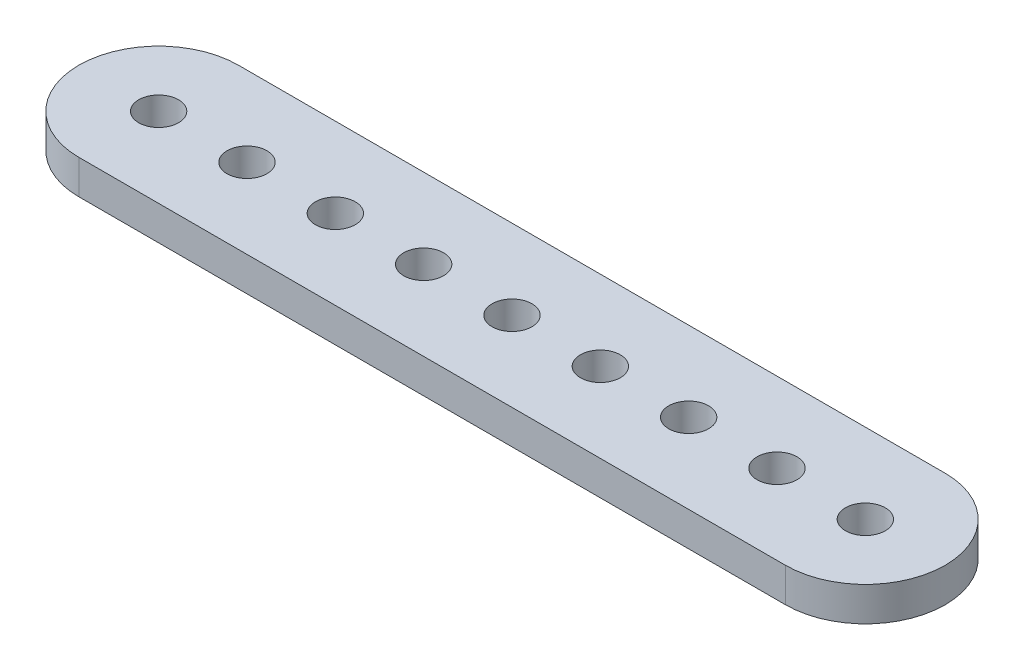
ISO-10303-21;
HEADER;
FILE_DESCRIPTION(('STEP AP214'),'2;1');
FILE_NAME('part.step','',(''),(''),'','','');
FILE_SCHEMA(('AUTOMOTIVE_DESIGN { 1 0 10303 214 1 1 1 1 }'));
ENDSEC;
DATA;
#1=APPLICATION_CONTEXT('core data for automotive mechanical design processes');
#2=APPLICATION_PROTOCOL_DEFINITION('international standard','automotive_design',2000,#1);
#3=PRODUCT_CONTEXT('',#1,'mechanical');
#4=PRODUCT('Part','Part','',(#3));
#5=PRODUCT_RELATED_PRODUCT_CATEGORY('part','',(#4));
#6=PRODUCT_DEFINITION_FORMATION('','',#4);
#7=PRODUCT_DEFINITION_CONTEXT('part definition',#1,'design');
#8=PRODUCT_DEFINITION('design','',#6,#7);
#9=PRODUCT_DEFINITION_SHAPE('','',#8);
#10=(LENGTH_UNIT() NAMED_UNIT(*) SI_UNIT(.MILLI.,.METRE.));
#11=(NAMED_UNIT(*) PLANE_ANGLE_UNIT() SI_UNIT($,.RADIAN.));
#12=(NAMED_UNIT(*) SI_UNIT($,.STERADIAN.) SOLID_ANGLE_UNIT());
#13=UNCERTAINTY_MEASURE_WITH_UNIT(LENGTH_MEASURE(1.E-05),#10,'distance_accuracy_value','');
#14=(GEOMETRIC_REPRESENTATION_CONTEXT(3) GLOBAL_UNCERTAINTY_ASSIGNED_CONTEXT((#13)) GLOBAL_UNIT_ASSIGNED_CONTEXT((#10,
#11,#12)) REPRESENTATION_CONTEXT('',''));
#15=CARTESIAN_POINT('',(0.,0.,0.));
#16=DIRECTION('',(0.,0.,1.));
#17=DIRECTION('',(1.,0.,0.));
#18=AXIS2_PLACEMENT_3D('',#15,#16,#17);
#19=CARTESIAN_POINT('',(19.1257208754836,6.,-9.45587762598098));
#20=DIRECTION('',(0.,1.,0.));
#21=DIRECTION('',(0.,0.,1.));
#22=AXIS2_PLACEMENT_3D('',#19,#20,#21);
#23=PLANE('',#22);
#24=CARTESIAN_POINT('',(19.1257208754836,6.,-9.45587762598098));
#25=DIRECTION('',(0.,1.,0.));
#26=DIRECTION('',(0.,0.,1.));
#27=AXIS2_PLACEMENT_3D('',#24,#25,#26);
#28=CIRCLE('',#27,3.50000000000001);
#29=CARTESIAN_POINT('',(19.1257208754836,6.,-5.95587762598097));
#30=VERTEX_POINT('',#29);
#31=EDGE_CURVE('E289',#30,#30,#28,.T.);
#32=ORIENTED_EDGE('',*,*,#31,.F.);
#33=EDGE_LOOP('',(#32));
#34=FACE_BOUND('',#33,.T.);
#35=CARTESIAN_POINT('',(-42.8742791245164,6.,-9.45587762598098));
#36=DIRECTION('',(0.,1.,0.));
#37=DIRECTION('',(0.,0.,1.));
#38=AXIS2_PLACEMENT_3D('',#35,#36,#37);
#39=CIRCLE('',#38,3.50000000000001);
#40=CARTESIAN_POINT('',(-42.8742791245164,6.,-5.95587762598097));
#41=VERTEX_POINT('',#40);
#42=EDGE_CURVE('E277',#41,#41,#39,.T.);
#43=ORIENTED_EDGE('',*,*,#42,.F.);
#44=EDGE_LOOP('',(#43));
#45=FACE_BOUND('',#44,.T.);
#46=CARTESIAN_POINT('',(-11.8742791245164,6.,-9.45587762598098));
#47=DIRECTION('',(0.,1.,0.));
#48=DIRECTION('',(0.,0.,1.));
#49=AXIS2_PLACEMENT_3D('',#46,#47,#48);
#50=CIRCLE('',#49,3.50000000000001);
#51=CARTESIAN_POINT('',(-11.8742791245164,6.,-5.95587762598097));
#52=VERTEX_POINT('',#51);
#53=EDGE_CURVE('E265',#52,#52,#50,.T.);
#54=ORIENTED_EDGE('',*,*,#53,.F.);
#55=EDGE_LOOP('',(#54));
#56=FACE_BOUND('',#55,.T.);
#57=CARTESIAN_POINT('',(-89.3742791245164,6.,-9.45587762598098));
#58=DIRECTION('',(0.,1.,0.));
#59=DIRECTION('',(0.,0.,1.));
#60=AXIS2_PLACEMENT_3D('',#57,#58,#59);
#61=CIRCLE('',#60,3.50000000000001);
#62=CARTESIAN_POINT('',(-89.3742791245164,6.,-5.95587762598097));
#63=VERTEX_POINT('',#62);
#64=EDGE_CURVE('E253',#63,#63,#61,.T.);
#65=ORIENTED_EDGE('',*,*,#64,.F.);
#66=EDGE_LOOP('',(#65));
#67=FACE_BOUND('',#66,.T.);
#68=DIRECTION('',(1.,0.,0.));
#69=VECTOR('',#68,1.);
#70=CARTESIAN_POINT('',(-104.874279124516,6.,4.54412237401902));
#71=LINE('',#70,#69);
#72=CARTESIAN_POINT('',(-104.874279124516,6.,4.54412237401902));
#73=VERTEX_POINT('',#72);
#74=CARTESIAN_POINT('',(19.1257208754836,6.,4.54412237401902));
#75=VERTEX_POINT('',#74);
#76=EDGE_CURVE('E224',#73,#75,#71,.T.);
#77=ORIENTED_EDGE('',*,*,#76,.T.);
#78=CARTESIAN_POINT('',(19.1257208754836,6.,-9.45587762598098));
#79=DIRECTION('',(0.,1.,0.));
#80=DIRECTION('',(0.,0.,1.));
#81=AXIS2_PLACEMENT_3D('',#78,#79,#80);
#82=CIRCLE('',#81,14.);
#83=CARTESIAN_POINT('',(19.1257208754836,6.,-23.455877625981));
#84=VERTEX_POINT('',#83);
#85=EDGE_CURVE('E216',#75,#84,#82,.T.);
#86=ORIENTED_EDGE('',*,*,#85,.T.);
#87=DIRECTION('',(1.,0.,0.));
#88=VECTOR('',#87,1.);
#89=CARTESIAN_POINT('',(-104.874279124516,6.,-23.455877625981));
#90=LINE('',#89,#88);
#91=CARTESIAN_POINT('',(-104.874279124516,6.,-23.455877625981));
#92=VERTEX_POINT('',#91);
#93=EDGE_CURVE('E223',#92,#84,#90,.T.);
#94=ORIENTED_EDGE('',*,*,#93,.F.);
#95=CARTESIAN_POINT('',(-104.874279124516,6.,-9.45587762598098));
#96=DIRECTION('',(0.,-1.,0.));
#97=DIRECTION('',(0.,0.,-1.));
#98=AXIS2_PLACEMENT_3D('',#95,#96,#97);
#99=CIRCLE('',#98,14.);
#100=EDGE_CURVE('E233',#73,#92,#99,.T.);
#101=ORIENTED_EDGE('',*,*,#100,.F.);
#102=EDGE_LOOP('',(#77,#86,#94,#101));
#103=FACE_BOUND('',#102,.T.);
#104=CARTESIAN_POINT('',(-73.8742791245164,6.,-9.45587762598098));
#105=DIRECTION('',(0.,1.,0.));
#106=DIRECTION('',(0.,0.,1.));
#107=AXIS2_PLACEMENT_3D('',#104,#105,#106);
#108=CIRCLE('',#107,3.50000000000001);
#109=CARTESIAN_POINT('',(-73.8742791245164,6.,-5.95587762598097));
#110=VERTEX_POINT('',#109);
#111=EDGE_CURVE('E240',#110,#110,#108,.T.);
#112=ORIENTED_EDGE('',*,*,#111,.F.);
#113=EDGE_LOOP('',(#112));
#114=FACE_BOUND('',#113,.T.);
#115=CARTESIAN_POINT('',(-104.874279124516,6.,-9.45587762598098));
#116=DIRECTION('',(0.,1.,0.));
#117=DIRECTION('',(0.,0.,1.));
#118=AXIS2_PLACEMENT_3D('',#115,#116,#117);
#119=CIRCLE('',#118,3.50000000000001);
#120=CARTESIAN_POINT('',(-104.874279124516,6.,-5.95587762598097));
#121=VERTEX_POINT('',#120);
#122=EDGE_CURVE('E259',#121,#121,#119,.T.);
#123=ORIENTED_EDGE('',*,*,#122,.F.);
#124=EDGE_LOOP('',(#123));
#125=FACE_BOUND('',#124,.T.);
#126=CARTESIAN_POINT('',(-27.3742791245164,6.,-9.45587762598098));
#127=DIRECTION('',(0.,1.,0.));
#128=DIRECTION('',(0.,0.,1.));
#129=AXIS2_PLACEMENT_3D('',#126,#127,#128);
#130=CIRCLE('',#129,3.50000000000001);
#131=CARTESIAN_POINT('',(-27.3742791245164,6.,-5.95587762598097));
#132=VERTEX_POINT('',#131);
#133=EDGE_CURVE('E271',#132,#132,#130,.T.);
#134=ORIENTED_EDGE('',*,*,#133,.F.);
#135=EDGE_LOOP('',(#134));
#136=FACE_BOUND('',#135,.T.);
#137=CARTESIAN_POINT('',(-58.3742791245164,6.,-9.45587762598098));
#138=DIRECTION('',(0.,1.,0.));
#139=DIRECTION('',(0.,0.,1.));
#140=AXIS2_PLACEMENT_3D('',#137,#138,#139);
#141=CIRCLE('',#140,3.50000000000001);
#142=CARTESIAN_POINT('',(-58.3742791245164,6.,-5.95587762598097));
#143=VERTEX_POINT('',#142);
#144=EDGE_CURVE('E283',#143,#143,#141,.T.);
#145=ORIENTED_EDGE('',*,*,#144,.F.);
#146=EDGE_LOOP('',(#145));
#147=FACE_BOUND('',#146,.T.);
#148=CARTESIAN_POINT('',(3.62572087548364,6.,-9.45587762598098));
#149=DIRECTION('',(0.,1.,0.));
#150=DIRECTION('',(0.,0.,1.));
#151=AXIS2_PLACEMENT_3D('',#148,#149,#150);
#152=CIRCLE('',#151,3.50000000000001);
#153=CARTESIAN_POINT('',(3.62572087548364,6.,-5.95587762598097));
#154=VERTEX_POINT('',#153);
#155=EDGE_CURVE('E295',#154,#154,#152,.T.);
#156=ORIENTED_EDGE('',*,*,#155,.F.);
#157=EDGE_LOOP('',(#156));
#158=FACE_BOUND('',#157,.T.);
#159=ADVANCED_FACE('F174',(#34,#45,#56,#67,#103,#114,#125,#136,#147,#158),#23,.T.);
#160=CARTESIAN_POINT('',(19.1257208754836,0.,-9.45587762598098));
#161=DIRECTION('',(0.,1.,0.));
#162=DIRECTION('',(0.,0.,1.));
#163=AXIS2_PLACEMENT_3D('',#160,#161,#162);
#164=PLANE('',#163);
#165=DIRECTION('',(1.,0.,0.));
#166=VECTOR('',#165,1.);
#167=CARTESIAN_POINT('',(-104.874279124516,0.,4.54412237401902));
#168=LINE('',#167,#166);
#169=CARTESIAN_POINT('',(-104.874279124516,0.,4.54412237401902));
#170=VERTEX_POINT('',#169);
#171=CARTESIAN_POINT('',(19.1257208754836,0.,4.54412237401902));
#172=VERTEX_POINT('',#171);
#173=EDGE_CURVE('E238',#170,#172,#168,.T.);
#174=ORIENTED_EDGE('',*,*,#173,.F.);
#175=CARTESIAN_POINT('',(-104.874279124516,0.,-9.45587762598098));
#176=DIRECTION('',(0.,-1.,0.));
#177=DIRECTION('',(0.,0.,-1.));
#178=AXIS2_PLACEMENT_3D('',#175,#176,#177);
#179=CIRCLE('',#178,14.);
#180=CARTESIAN_POINT('',(-104.874279124516,0.,-23.455877625981));
#181=VERTEX_POINT('',#180);
#182=EDGE_CURVE('E244',#170,#181,#179,.T.);
#183=ORIENTED_EDGE('',*,*,#182,.T.);
#184=DIRECTION('',(1.,0.,0.));
#185=VECTOR('',#184,1.);
#186=CARTESIAN_POINT('',(-104.874279124516,0.,-23.455877625981));
#187=LINE('',#186,#185);
#188=CARTESIAN_POINT('',(19.1257208754836,0.,-23.455877625981));
#189=VERTEX_POINT('',#188);
#190=EDGE_CURVE('E242',#181,#189,#187,.T.);
#191=ORIENTED_EDGE('',*,*,#190,.T.);
#192=CARTESIAN_POINT('',(19.1257208754836,0.,-9.45587762598098));
#193=DIRECTION('',(0.,1.,0.));
#194=DIRECTION('',(0.,0.,1.));
#195=AXIS2_PLACEMENT_3D('',#192,#193,#194);
#196=CIRCLE('',#195,14.);
#197=EDGE_CURVE('E229',#172,#189,#196,.T.);
#198=ORIENTED_EDGE('',*,*,#197,.F.);
#199=EDGE_LOOP('',(#174,#183,#191,#198));
#200=FACE_BOUND('',#199,.T.);
#201=CARTESIAN_POINT('',(-73.8742791245164,0.,-9.45587762598098));
#202=DIRECTION('',(0.,1.,0.));
#203=DIRECTION('',(0.,0.,1.));
#204=AXIS2_PLACEMENT_3D('',#201,#202,#203);
#205=CIRCLE('',#204,3.50000000000001);
#206=CARTESIAN_POINT('',(-73.8742791245164,0.,-5.95587762598097));
#207=VERTEX_POINT('',#206);
#208=EDGE_CURVE('E250',#207,#207,#205,.T.);
#209=ORIENTED_EDGE('',*,*,#208,.T.);
#210=EDGE_LOOP('',(#209));
#211=FACE_BOUND('',#210,.T.);
#212=CARTESIAN_POINT('',(-89.3742791245164,0.,-9.45587762598098));
#213=DIRECTION('',(0.,1.,0.));
#214=DIRECTION('',(0.,0.,1.));
#215=AXIS2_PLACEMENT_3D('',#212,#213,#214);
#216=CIRCLE('',#215,3.50000000000001);
#217=CARTESIAN_POINT('',(-89.3742791245164,0.,-5.95587762598097));
#218=VERTEX_POINT('',#217);
#219=EDGE_CURVE('E256',#218,#218,#216,.T.);
#220=ORIENTED_EDGE('',*,*,#219,.T.);
#221=EDGE_LOOP('',(#220));
#222=FACE_BOUND('',#221,.T.);
#223=CARTESIAN_POINT('',(-104.874279124516,0.,-9.45587762598098));
#224=DIRECTION('',(0.,1.,0.));
#225=DIRECTION('',(0.,0.,1.));
#226=AXIS2_PLACEMENT_3D('',#223,#224,#225);
#227=CIRCLE('',#226,3.50000000000001);
#228=CARTESIAN_POINT('',(-104.874279124516,0.,-5.95587762598097));
#229=VERTEX_POINT('',#228);
#230=EDGE_CURVE('E262',#229,#229,#227,.T.);
#231=ORIENTED_EDGE('',*,*,#230,.T.);
#232=EDGE_LOOP('',(#231));
#233=FACE_BOUND('',#232,.T.);
#234=CARTESIAN_POINT('',(-11.8742791245164,0.,-9.45587762598098));
#235=DIRECTION('',(0.,1.,0.));
#236=DIRECTION('',(0.,0.,1.));
#237=AXIS2_PLACEMENT_3D('',#234,#235,#236);
#238=CIRCLE('',#237,3.50000000000001);
#239=CARTESIAN_POINT('',(-11.8742791245164,0.,-5.95587762598097));
#240=VERTEX_POINT('',#239);
#241=EDGE_CURVE('E268',#240,#240,#238,.T.);
#242=ORIENTED_EDGE('',*,*,#241,.T.);
#243=EDGE_LOOP('',(#242));
#244=FACE_BOUND('',#243,.T.);
#245=CARTESIAN_POINT('',(-27.3742791245164,0.,-9.45587762598098));
#246=DIRECTION('',(0.,1.,0.));
#247=DIRECTION('',(0.,0.,1.));
#248=AXIS2_PLACEMENT_3D('',#245,#246,#247);
#249=CIRCLE('',#248,3.50000000000001);
#250=CARTESIAN_POINT('',(-27.3742791245164,0.,-5.95587762598097));
#251=VERTEX_POINT('',#250);
#252=EDGE_CURVE('E274',#251,#251,#249,.T.);
#253=ORIENTED_EDGE('',*,*,#252,.T.);
#254=EDGE_LOOP('',(#253));
#255=FACE_BOUND('',#254,.T.);
#256=CARTESIAN_POINT('',(-42.8742791245164,0.,-9.45587762598098));
#257=DIRECTION('',(0.,1.,0.));
#258=DIRECTION('',(0.,0.,1.));
#259=AXIS2_PLACEMENT_3D('',#256,#257,#258);
#260=CIRCLE('',#259,3.50000000000001);
#261=CARTESIAN_POINT('',(-42.8742791245164,0.,-5.95587762598097));
#262=VERTEX_POINT('',#261);
#263=EDGE_CURVE('E280',#262,#262,#260,.T.);
#264=ORIENTED_EDGE('',*,*,#263,.T.);
#265=EDGE_LOOP('',(#264));
#266=FACE_BOUND('',#265,.T.);
#267=CARTESIAN_POINT('',(-58.3742791245164,0.,-9.45587762598098));
#268=DIRECTION('',(0.,1.,0.));
#269=DIRECTION('',(0.,0.,1.));
#270=AXIS2_PLACEMENT_3D('',#267,#268,#269);
#271=CIRCLE('',#270,3.50000000000001);
#272=CARTESIAN_POINT('',(-58.3742791245164,0.,-5.95587762598097));
#273=VERTEX_POINT('',#272);
#274=EDGE_CURVE('E286',#273,#273,#271,.T.);
#275=ORIENTED_EDGE('',*,*,#274,.T.);
#276=EDGE_LOOP('',(#275));
#277=FACE_BOUND('',#276,.T.);
#278=CARTESIAN_POINT('',(19.1257208754836,0.,-9.45587762598098));
#279=DIRECTION('',(0.,1.,0.));
#280=DIRECTION('',(0.,0.,1.));
#281=AXIS2_PLACEMENT_3D('',#278,#279,#280);
#282=CIRCLE('',#281,3.50000000000001);
#283=CARTESIAN_POINT('',(19.1257208754836,0.,-5.95587762598097));
#284=VERTEX_POINT('',#283);
#285=EDGE_CURVE('E292',#284,#284,#282,.T.);
#286=ORIENTED_EDGE('',*,*,#285,.T.);
#287=EDGE_LOOP('',(#286));
#288=FACE_BOUND('',#287,.T.);
#289=CARTESIAN_POINT('',(3.62572087548364,0.,-9.45587762598098));
#290=DIRECTION('',(0.,1.,0.));
#291=DIRECTION('',(0.,0.,1.));
#292=AXIS2_PLACEMENT_3D('',#289,#290,#291);
#293=CIRCLE('',#292,3.50000000000001);
#294=CARTESIAN_POINT('',(3.62572087548364,0.,-5.95587762598097));
#295=VERTEX_POINT('',#294);
#296=EDGE_CURVE('E298',#295,#295,#293,.T.);
#297=ORIENTED_EDGE('',*,*,#296,.T.);
#298=EDGE_LOOP('',(#297));
#299=FACE_BOUND('',#298,.T.);
#300=ADVANCED_FACE('F308',(#200,#211,#222,#233,#244,#255,#266,#277,#288,#299),#164,.F.);
#301=CARTESIAN_POINT('',(-104.874279124516,6.,4.54412237401902));
#302=DIRECTION('',(0.,0.,-1.));
#303=DIRECTION('',(-1.,0.,0.));
#304=AXIS2_PLACEMENT_3D('',#301,#302,#303);
#305=PLANE('',#304);
#306=ORIENTED_EDGE('',*,*,#173,.T.);
#307=DIRECTION('',(0.,-1.,0.));
#308=VECTOR('',#307,1.);
#309=CARTESIAN_POINT('',(19.1257208754836,6.,4.54412237401902));
#310=LINE('',#309,#308);
#311=EDGE_CURVE('E12',#75,#172,#310,.T.);
#312=ORIENTED_EDGE('',*,*,#311,.F.);
#313=ORIENTED_EDGE('',*,*,#76,.F.);
#314=DIRECTION('',(0.,-1.,0.));
#315=VECTOR('',#314,1.);
#316=CARTESIAN_POINT('',(-104.874279124516,6.,4.54412237401902));
#317=LINE('',#316,#315);
#318=EDGE_CURVE('E191',#73,#170,#317,.T.);
#319=ORIENTED_EDGE('',*,*,#318,.T.);
#320=EDGE_LOOP('',(#306,#312,#313,#319));
#321=FACE_BOUND('',#320,.T.);
#322=ADVANCED_FACE('F176',(#321),#305,.F.);
#323=CARTESIAN_POINT('',(19.1257208754836,6.,-9.45587762598098));
#324=DIRECTION('',(0.,-1.,0.));
#325=DIRECTION('',(0.,0.,-1.));
#326=AXIS2_PLACEMENT_3D('',#323,#324,#325);
#327=CYLINDRICAL_SURFACE('',#326,14.);
#328=ORIENTED_EDGE('',*,*,#197,.T.);
#329=DIRECTION('',(0.,-1.,0.));
#330=VECTOR('',#329,1.);
#331=CARTESIAN_POINT('',(19.1257208754836,6.,-23.455877625981));
#332=LINE('',#331,#330);
#333=EDGE_CURVE('E183',#84,#189,#332,.T.);
#334=ORIENTED_EDGE('',*,*,#333,.F.);
#335=ORIENTED_EDGE('',*,*,#85,.F.);
#336=ORIENTED_EDGE('',*,*,#311,.T.);
#337=EDGE_LOOP('',(#328,#334,#335,#336));
#338=FACE_BOUND('',#337,.T.);
#339=ADVANCED_FACE('F228',(#338),#327,.T.);
#340=CARTESIAN_POINT('',(-104.874279124516,6.,-23.455877625981));
#341=DIRECTION('',(0.,0.,-1.));
#342=DIRECTION('',(-1.,0.,0.));
#343=AXIS2_PLACEMENT_3D('',#340,#341,#342);
#344=PLANE('',#343);
#345=ORIENTED_EDGE('',*,*,#190,.F.);
#346=DIRECTION('',(0.,-1.,0.));
#347=VECTOR('',#346,1.);
#348=CARTESIAN_POINT('',(-104.874279124516,6.,-23.455877625981));
#349=LINE('',#348,#347);
#350=EDGE_CURVE('E205',#92,#181,#349,.T.);
#351=ORIENTED_EDGE('',*,*,#350,.F.);
#352=ORIENTED_EDGE('',*,*,#93,.T.);
#353=ORIENTED_EDGE('',*,*,#333,.T.);
#354=EDGE_LOOP('',(#345,#351,#352,#353));
#355=FACE_BOUND('',#354,.T.);
#356=ADVANCED_FACE('F232',(#355),#344,.T.);
#357=CARTESIAN_POINT('',(-104.874279124516,6.,-9.45587762598098));
#358=DIRECTION('',(0.,-1.,0.));
#359=DIRECTION('',(0.,0.,-1.));
#360=AXIS2_PLACEMENT_3D('',#357,#358,#359);
#361=CYLINDRICAL_SURFACE('',#360,14.);
#362=ORIENTED_EDGE('',*,*,#182,.F.);
#363=ORIENTED_EDGE('',*,*,#318,.F.);
#364=ORIENTED_EDGE('',*,*,#100,.T.);
#365=ORIENTED_EDGE('',*,*,#350,.T.);
#366=EDGE_LOOP('',(#362,#363,#364,#365));
#367=FACE_BOUND('',#366,.T.);
#368=ADVANCED_FACE('F321',(#367),#361,.T.);
#369=CARTESIAN_POINT('',(-73.8742791245164,6.,-9.45587762598098));
#370=DIRECTION('',(0.,-1.,0.));
#371=DIRECTION('',(0.,0.,-1.));
#372=AXIS2_PLACEMENT_3D('',#369,#370,#371);
#373=CYLINDRICAL_SURFACE('',#372,3.50000000000001);
#374=ORIENTED_EDGE('',*,*,#111,.T.);
#375=EDGE_LOOP('',(#374));
#376=FACE_BOUND('',#375,.T.);
#377=ORIENTED_EDGE('',*,*,#208,.F.);
#378=EDGE_LOOP('',(#377));
#379=FACE_BOUND('',#378,.T.);
#380=ADVANCED_FACE('F318',(#376,#379),#373,.F.);
#381=CARTESIAN_POINT('',(-89.3742791245164,6.,-9.45587762598098));
#382=DIRECTION('',(0.,-1.,0.));
#383=DIRECTION('',(0.,0.,-1.));
#384=AXIS2_PLACEMENT_3D('',#381,#382,#383);
#385=CYLINDRICAL_SURFACE('',#384,3.50000000000001);
#386=ORIENTED_EDGE('',*,*,#64,.T.);
#387=EDGE_LOOP('',(#386));
#388=FACE_BOUND('',#387,.T.);
#389=ORIENTED_EDGE('',*,*,#219,.F.);
#390=EDGE_LOOP('',(#389));
#391=FACE_BOUND('',#390,.T.);
#392=ADVANCED_FACE('F376',(#388,#391),#385,.F.);
#393=CARTESIAN_POINT('',(-104.874279124516,6.,-9.45587762598098));
#394=DIRECTION('',(0.,-1.,0.));
#395=DIRECTION('',(0.,0.,-1.));
#396=AXIS2_PLACEMENT_3D('',#393,#394,#395);
#397=CYLINDRICAL_SURFACE('',#396,3.50000000000001);
#398=ORIENTED_EDGE('',*,*,#122,.T.);
#399=EDGE_LOOP('',(#398));
#400=FACE_BOUND('',#399,.T.);
#401=ORIENTED_EDGE('',*,*,#230,.F.);
#402=EDGE_LOOP('',(#401));
#403=FACE_BOUND('',#402,.T.);
#404=ADVANCED_FACE('F373',(#400,#403),#397,.F.);
#405=CARTESIAN_POINT('',(-11.8742791245164,6.,-9.45587762598098));
#406=DIRECTION('',(0.,-1.,0.));
#407=DIRECTION('',(0.,0.,-1.));
#408=AXIS2_PLACEMENT_3D('',#405,#406,#407);
#409=CYLINDRICAL_SURFACE('',#408,3.50000000000001);
#410=ORIENTED_EDGE('',*,*,#53,.T.);
#411=EDGE_LOOP('',(#410));
#412=FACE_BOUND('',#411,.T.);
#413=ORIENTED_EDGE('',*,*,#241,.F.);
#414=EDGE_LOOP('',(#413));
#415=FACE_BOUND('',#414,.T.);
#416=ADVANCED_FACE('F369',(#412,#415),#409,.F.);
#417=CARTESIAN_POINT('',(-27.3742791245164,6.,-9.45587762598098));
#418=DIRECTION('',(0.,-1.,0.));
#419=DIRECTION('',(0.,0.,-1.));
#420=AXIS2_PLACEMENT_3D('',#417,#418,#419);
#421=CYLINDRICAL_SURFACE('',#420,3.50000000000001);
#422=ORIENTED_EDGE('',*,*,#133,.T.);
#423=EDGE_LOOP('',(#422));
#424=FACE_BOUND('',#423,.T.);
#425=ORIENTED_EDGE('',*,*,#252,.F.);
#426=EDGE_LOOP('',(#425));
#427=FACE_BOUND('',#426,.T.);
#428=ADVANCED_FACE('F365',(#424,#427),#421,.F.);
#429=CARTESIAN_POINT('',(-42.8742791245164,6.,-9.45587762598098));
#430=DIRECTION('',(0.,-1.,0.));
#431=DIRECTION('',(0.,0.,-1.));
#432=AXIS2_PLACEMENT_3D('',#429,#430,#431);
#433=CYLINDRICAL_SURFACE('',#432,3.50000000000001);
#434=ORIENTED_EDGE('',*,*,#42,.T.);
#435=EDGE_LOOP('',(#434));
#436=FACE_BOUND('',#435,.T.);
#437=ORIENTED_EDGE('',*,*,#263,.F.);
#438=EDGE_LOOP('',(#437));
#439=FACE_BOUND('',#438,.T.);
#440=ADVANCED_FACE('F361',(#436,#439),#433,.F.);
#441=CARTESIAN_POINT('',(-58.3742791245164,6.,-9.45587762598098));
#442=DIRECTION('',(0.,-1.,0.));
#443=DIRECTION('',(0.,0.,-1.));
#444=AXIS2_PLACEMENT_3D('',#441,#442,#443);
#445=CYLINDRICAL_SURFACE('',#444,3.50000000000001);
#446=ORIENTED_EDGE('',*,*,#144,.T.);
#447=EDGE_LOOP('',(#446));
#448=FACE_BOUND('',#447,.T.);
#449=ORIENTED_EDGE('',*,*,#274,.F.);
#450=EDGE_LOOP('',(#449));
#451=FACE_BOUND('',#450,.T.);
#452=ADVANCED_FACE('F355',(#448,#451),#445,.F.);
#453=CARTESIAN_POINT('',(19.1257208754836,6.,-9.45587762598098));
#454=DIRECTION('',(0.,-1.,0.));
#455=DIRECTION('',(0.,0.,-1.));
#456=AXIS2_PLACEMENT_3D('',#453,#454,#455);
#457=CYLINDRICAL_SURFACE('',#456,3.50000000000001);
#458=ORIENTED_EDGE('',*,*,#31,.T.);
#459=EDGE_LOOP('',(#458));
#460=FACE_BOUND('',#459,.T.);
#461=ORIENTED_EDGE('',*,*,#285,.F.);
#462=EDGE_LOOP('',(#461));
#463=FACE_BOUND('',#462,.T.);
#464=ADVANCED_FACE('F350',(#460,#463),#457,.F.);
#465=CARTESIAN_POINT('',(3.62572087548364,6.,-9.45587762598098));
#466=DIRECTION('',(0.,-1.,0.));
#467=DIRECTION('',(0.,0.,-1.));
#468=AXIS2_PLACEMENT_3D('',#465,#466,#467);
#469=CYLINDRICAL_SURFACE('',#468,3.50000000000001);
#470=ORIENTED_EDGE('',*,*,#155,.T.);
#471=EDGE_LOOP('',(#470));
#472=FACE_BOUND('',#471,.T.);
#473=ORIENTED_EDGE('',*,*,#296,.F.);
#474=EDGE_LOOP('',(#473));
#475=FACE_BOUND('',#474,.T.);
#476=ADVANCED_FACE('F304',(#472,#475),#469,.F.);
#477=CLOSED_SHELL('',(#159,#300,#322,#339,#356,#368,#380,#392,#404,#416,#428,#440,#452,#464,#476));
#478=MANIFOLD_SOLID_BREP('B2',#477);
#479=ADVANCED_BREP_SHAPE_REPRESENTATION('',(#18,#478),#14);
#480=SHAPE_DEFINITION_REPRESENTATION(#9,#479);
ENDSEC;
END-ISO-10303-21;
